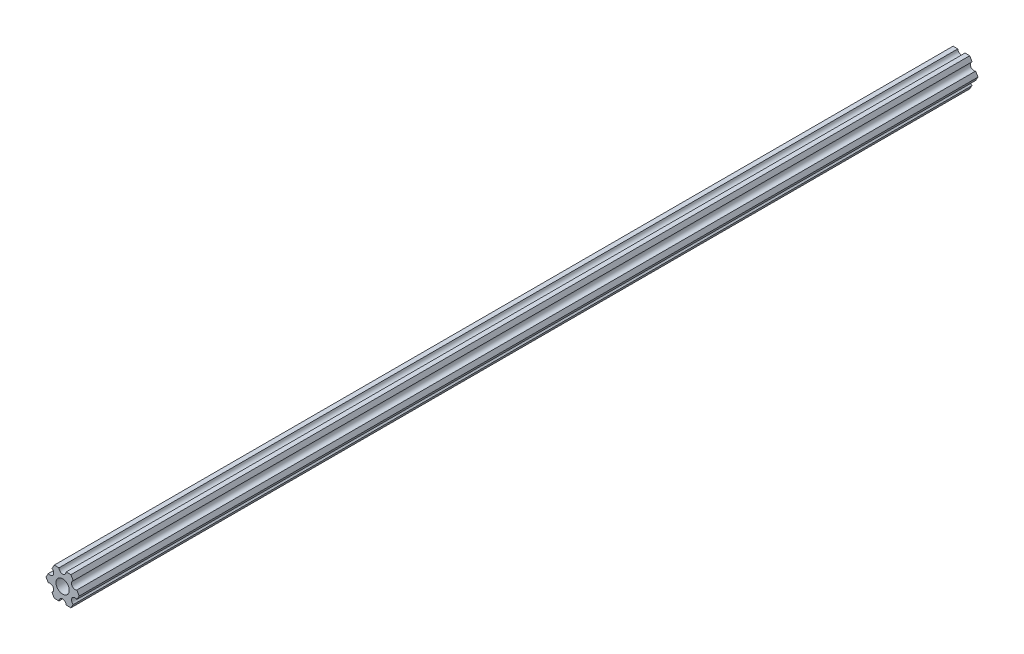
ISO-10303-21;
HEADER;
FILE_DESCRIPTION(('STEP AP214'),'2;1');
FILE_NAME('part.step','',(''),(''),'','','');
FILE_SCHEMA(('AUTOMOTIVE_DESIGN { 1 0 10303 214 1 1 1 1 }'));
ENDSEC;
DATA;
#1=APPLICATION_CONTEXT('core data for automotive mechanical design processes');
#2=APPLICATION_PROTOCOL_DEFINITION('international standard','automotive_design',2000,#1);
#3=PRODUCT_CONTEXT('',#1,'mechanical');
#4=PRODUCT('Part','Part','',(#3));
#5=PRODUCT_RELATED_PRODUCT_CATEGORY('part','',(#4));
#6=PRODUCT_DEFINITION_FORMATION('','',#4);
#7=PRODUCT_DEFINITION_CONTEXT('part definition',#1,'design');
#8=PRODUCT_DEFINITION('design','',#6,#7);
#9=PRODUCT_DEFINITION_SHAPE('','',#8);
#10=(LENGTH_UNIT() NAMED_UNIT(*) SI_UNIT(.MILLI.,.METRE.));
#11=(NAMED_UNIT(*) PLANE_ANGLE_UNIT() SI_UNIT($,.RADIAN.));
#12=(NAMED_UNIT(*) SI_UNIT($,.STERADIAN.) SOLID_ANGLE_UNIT());
#13=UNCERTAINTY_MEASURE_WITH_UNIT(LENGTH_MEASURE(1.E-05),#10,'distance_accuracy_value','');
#14=(GEOMETRIC_REPRESENTATION_CONTEXT(3) GLOBAL_UNCERTAINTY_ASSIGNED_CONTEXT((#13)) GLOBAL_UNIT_ASSIGNED_CONTEXT((#10,
#11,#12)) REPRESENTATION_CONTEXT('',''));
#15=CARTESIAN_POINT('',(0.,0.,0.));
#16=DIRECTION('',(0.,0.,1.));
#17=DIRECTION('',(1.,0.,0.));
#18=AXIS2_PLACEMENT_3D('',#15,#16,#17);
#19=CARTESIAN_POINT('',(5.49926169873049,-3.17500022210629,-92.075));
#20=DIRECTION('',(0.,0.,1.));
#21=DIRECTION('',(1.,0.,0.));
#22=AXIS2_PLACEMENT_3D('',#19,#20,#21);
#23=CYLINDRICAL_SURFACE('',#22,1.5875);
#24=CARTESIAN_POINT('',(5.49926169873049,-3.17500022210629,304.8));
#25=DIRECTION('',(0.,0.,-1.));
#26=DIRECTION('',(-1.,0.,0.));
#27=AXIS2_PLACEMENT_3D('',#24,#25,#26);
#28=CIRCLE('',#27,1.5875);
#29=CARTESIAN_POINT('',(4.7055116987305,-4.5498155506141,304.8));
#30=VERTEX_POINT('',#29);
#31=CARTESIAN_POINT('',(6.29301169873047,-1.80018489359848,304.8));
#32=VERTEX_POINT('',#31);
#33=EDGE_CURVE('E191',#30,#32,#28,.T.);
#34=ORIENTED_EDGE('',*,*,#33,.F.);
#35=DIRECTION('',(0.,0.,1.));
#36=VECTOR('',#35,1.);
#37=CARTESIAN_POINT('',(4.7055116987305,-4.5498155506141,-92.075));
#38=LINE('',#37,#36);
#39=CARTESIAN_POINT('',(4.7055116987305,-4.5498155506141,-92.075));
#40=VERTEX_POINT('',#39);
#41=EDGE_CURVE('E11',#40,#30,#38,.T.);
#42=ORIENTED_EDGE('',*,*,#41,.F.);
#43=CARTESIAN_POINT('',(5.49926169873049,-3.17500022210629,-92.075));
#44=DIRECTION('',(0.,0.,-1.));
#45=DIRECTION('',(-1.,0.,0.));
#46=AXIS2_PLACEMENT_3D('',#43,#44,#45);
#47=CIRCLE('',#46,1.5875);
#48=CARTESIAN_POINT('',(6.29301169873047,-1.80018489359848,-92.075));
#49=VERTEX_POINT('',#48);
#50=EDGE_CURVE('E242',#40,#49,#47,.T.);
#51=ORIENTED_EDGE('',*,*,#50,.T.);
#52=DIRECTION('',(0.,0.,1.));
#53=VECTOR('',#52,1.);
#54=CARTESIAN_POINT('',(6.29301169873047,-1.80018489359848,-92.075));
#55=LINE('',#54,#53);
#56=EDGE_CURVE('E37',#49,#32,#55,.T.);
#57=ORIENTED_EDGE('',*,*,#56,.T.);
#58=EDGE_LOOP('',(#34,#42,#51,#57));
#59=FACE_BOUND('',#58,.T.);
#60=ADVANCED_FACE('F34',(#59),#23,.F.);
#61=CARTESIAN_POINT('',(3.6661745940535,-6.35000022210627,-92.075));
#62=DIRECTION('',(0.866025403784446,-0.499999999999988,0.));
#63=DIRECTION('',(0.499999999999988,0.866025403784446,0.));
#64=AXIS2_PLACEMENT_3D('',#61,#62,#63);
#65=PLANE('',#64);
#66=DIRECTION('',(0.499999999999988,0.866025403784446,0.));
#67=VECTOR('',#66,1.);
#68=CARTESIAN_POINT('',(3.6661745940535,-6.35000022210627,304.8));
#69=LINE('',#68,#67);
#70=CARTESIAN_POINT('',(3.6661745940535,-6.35000022210627,304.8));
#71=VERTEX_POINT('',#70);
#72=EDGE_CURVE('E240',#71,#30,#69,.T.);
#73=ORIENTED_EDGE('',*,*,#72,.F.);
#74=DIRECTION('',(0.,0.,1.));
#75=VECTOR('',#74,1.);
#76=CARTESIAN_POINT('',(3.6661745940535,-6.35000022210627,-92.075));
#77=LINE('',#76,#75);
#78=CARTESIAN_POINT('',(3.6661745940535,-6.35000022210627,-92.075));
#79=VERTEX_POINT('',#78);
#80=EDGE_CURVE('E43',#79,#71,#77,.T.);
#81=ORIENTED_EDGE('',*,*,#80,.F.);
#82=DIRECTION('',(0.499999999999988,0.866025403784446,0.));
#83=VECTOR('',#82,1.);
#84=CARTESIAN_POINT('',(3.6661745940535,-6.35000022210627,-92.075));
#85=LINE('',#84,#83);
#86=EDGE_CURVE('E181',#79,#40,#85,.T.);
#87=ORIENTED_EDGE('',*,*,#86,.T.);
#88=ORIENTED_EDGE('',*,*,#41,.T.);
#89=EDGE_LOOP('',(#73,#81,#87,#88));
#90=FACE_BOUND('',#89,.T.);
#91=ADVANCED_FACE('F274',(#90),#65,.T.);
#92=CARTESIAN_POINT('',(1.58750038469929,-6.35000022210627,-92.075));
#93=DIRECTION('',(0.,-1.,0.));
#94=DIRECTION('',(0.,0.,-1.));
#95=AXIS2_PLACEMENT_3D('',#92,#93,#94);
#96=PLANE('',#95);
#97=DIRECTION('',(1.,0.,0.));
#98=VECTOR('',#97,1.);
#99=CARTESIAN_POINT('',(1.58750038469929,-6.35000022210627,304.8));
#100=LINE('',#99,#98);
#101=CARTESIAN_POINT('',(1.58750038469929,-6.35000022210627,304.8));
#102=VERTEX_POINT('',#101);
#103=EDGE_CURVE('E168',#102,#71,#100,.T.);
#104=ORIENTED_EDGE('',*,*,#103,.F.);
#105=DIRECTION('',(0.,0.,1.));
#106=VECTOR('',#105,1.);
#107=CARTESIAN_POINT('',(1.58750038469929,-6.35000022210627,-92.075));
#108=LINE('',#107,#106);
#109=CARTESIAN_POINT('',(1.58750038469929,-6.35000022210627,-92.075));
#110=VERTEX_POINT('',#109);
#111=EDGE_CURVE('E163',#110,#102,#108,.T.);
#112=ORIENTED_EDGE('',*,*,#111,.F.);
#113=DIRECTION('',(1.,0.,0.));
#114=VECTOR('',#113,1.);
#115=CARTESIAN_POINT('',(1.58750038469929,-6.35000022210627,-92.075));
#116=LINE('',#115,#114);
#117=EDGE_CURVE('E166',#110,#79,#116,.T.);
#118=ORIENTED_EDGE('',*,*,#117,.T.);
#119=ORIENTED_EDGE('',*,*,#80,.T.);
#120=EDGE_LOOP('',(#104,#112,#118,#119));
#121=FACE_BOUND('',#120,.T.);
#122=ADVANCED_FACE('F165',(#121),#96,.T.);
#123=CARTESIAN_POINT('',(3.84699290671026E-07,-6.35000022210627,-92.075));
#124=DIRECTION('',(0.,0.,1.));
#125=DIRECTION('',(1.,0.,0.));
#126=AXIS2_PLACEMENT_3D('',#123,#124,#125);
#127=CYLINDRICAL_SURFACE('',#126,1.5875);
#128=CARTESIAN_POINT('',(3.84699290671026E-07,-6.35000022210627,304.8));
#129=DIRECTION('',(0.,0.,-1.));
#130=DIRECTION('',(-1.,0.,0.));
#131=AXIS2_PLACEMENT_3D('',#128,#129,#130);
#132=CIRCLE('',#131,1.5875);
#133=CARTESIAN_POINT('',(-1.58749961530071,-6.35000022210627,304.8));
#134=VERTEX_POINT('',#133);
#135=EDGE_CURVE('E237',#134,#102,#132,.T.);
#136=ORIENTED_EDGE('',*,*,#135,.F.);
#137=DIRECTION('',(0.,0.,1.));
#138=VECTOR('',#137,1.);
#139=CARTESIAN_POINT('',(-1.58749961530071,-6.35000022210627,-92.075));
#140=LINE('',#139,#138);
#141=CARTESIAN_POINT('',(-1.58749961530071,-6.35000022210627,-92.075));
#142=VERTEX_POINT('',#141);
#143=EDGE_CURVE('E173',#142,#134,#140,.T.);
#144=ORIENTED_EDGE('',*,*,#143,.F.);
#145=CARTESIAN_POINT('',(3.84699290671026E-07,-6.35000022210627,-92.075));
#146=DIRECTION('',(0.,0.,-1.));
#147=DIRECTION('',(-1.,0.,0.));
#148=AXIS2_PLACEMENT_3D('',#145,#146,#147);
#149=CIRCLE('',#148,1.5875);
#150=EDGE_CURVE('E179',#142,#110,#149,.T.);
#151=ORIENTED_EDGE('',*,*,#150,.T.);
#152=ORIENTED_EDGE('',*,*,#111,.T.);
#153=EDGE_LOOP('',(#136,#144,#151,#152));
#154=FACE_BOUND('',#153,.T.);
#155=ADVANCED_FACE('F183',(#154),#127,.F.);
#156=CARTESIAN_POINT('',(-3.66617382465478,-6.35000022210627,-92.075));
#157=DIRECTION('',(0.,-1.,0.));
#158=DIRECTION('',(1.,0.,0.));
#159=AXIS2_PLACEMENT_3D('',#156,#157,#158);
#160=PLANE('',#159);
#161=DIRECTION('',(1.,0.,0.));
#162=VECTOR('',#161,1.);
#163=CARTESIAN_POINT('',(-3.66617382465478,-6.35000022210627,304.8));
#164=LINE('',#163,#162);
#165=CARTESIAN_POINT('',(-3.66617382465478,-6.35000022210627,304.8));
#166=VERTEX_POINT('',#165);
#167=EDGE_CURVE('E234',#166,#134,#164,.T.);
#168=ORIENTED_EDGE('',*,*,#167,.F.);
#169=DIRECTION('',(0.,0.,1.));
#170=VECTOR('',#169,1.);
#171=CARTESIAN_POINT('',(-3.66617382465478,-6.35000022210627,-92.075));
#172=LINE('',#171,#170);
#173=CARTESIAN_POINT('',(-3.66617382465478,-6.35000022210627,-92.075));
#174=VERTEX_POINT('',#173);
#175=EDGE_CURVE('E246',#174,#166,#172,.T.);
#176=ORIENTED_EDGE('',*,*,#175,.F.);
#177=DIRECTION('',(1.,0.,0.));
#178=VECTOR('',#177,1.);
#179=CARTESIAN_POINT('',(-3.66617382465478,-6.35000022210627,-92.075));
#180=LINE('',#179,#178);
#181=EDGE_CURVE('E184',#174,#142,#180,.T.);
#182=ORIENTED_EDGE('',*,*,#181,.T.);
#183=ORIENTED_EDGE('',*,*,#143,.T.);
#184=EDGE_LOOP('',(#168,#176,#182,#183));
#185=FACE_BOUND('',#184,.T.);
#186=ADVANCED_FACE('F287',(#185),#160,.T.);
#187=CARTESIAN_POINT('',(-4.70551103839171,-4.54981561357971,-92.075));
#188=DIRECTION('',(-0.866025373493149,-0.500000052466048,0.));
#189=DIRECTION('',(0.500000052466048,-0.86602537349315,0.));
#190=AXIS2_PLACEMENT_3D('',#187,#188,#189);
#191=PLANE('',#190);
#192=DIRECTION('',(0.500000052466048,-0.866025373493149,0.));
#193=VECTOR('',#192,1.);
#194=CARTESIAN_POINT('',(-4.70551103839171,-4.54981561357971,304.8));
#195=LINE('',#194,#193);
#196=CARTESIAN_POINT('',(-4.70551103839171,-4.54981561357971,304.8));
#197=VERTEX_POINT('',#196);
#198=EDGE_CURVE('E231',#197,#166,#195,.T.);
#199=ORIENTED_EDGE('',*,*,#198,.F.);
#200=DIRECTION('',(0.,0.,1.));
#201=VECTOR('',#200,1.);
#202=CARTESIAN_POINT('',(-4.70551103839171,-4.54981561357971,-92.075));
#203=LINE('',#202,#201);
#204=CARTESIAN_POINT('',(-4.70551103839171,-4.54981561357971,-92.075));
#205=VERTEX_POINT('',#204);
#206=EDGE_CURVE('E248',#205,#197,#203,.T.);
#207=ORIENTED_EDGE('',*,*,#206,.F.);
#208=DIRECTION('',(0.500000052466048,-0.866025373493149,0.));
#209=VECTOR('',#208,1.);
#210=CARTESIAN_POINT('',(-4.70551103839171,-4.54981561357971,-92.075));
#211=LINE('',#210,#209);
#212=EDGE_CURVE('E186',#205,#174,#211,.T.);
#213=ORIENTED_EDGE('',*,*,#212,.T.);
#214=ORIENTED_EDGE('',*,*,#175,.T.);
#215=EDGE_LOOP('',(#199,#207,#213,#214));
#216=FACE_BOUND('',#215,.T.);
#217=ADVANCED_FACE('F290',(#216),#191,.T.);
#218=CARTESIAN_POINT('',(-5.49926112168156,-3.17500033315934,-92.075));
#219=DIRECTION('',(0.,0.,1.));
#220=DIRECTION('',(1.,0.,0.));
#221=AXIS2_PLACEMENT_3D('',#218,#219,#220);
#222=CYLINDRICAL_SURFACE('',#221,1.5875);
#223=CARTESIAN_POINT('',(-5.49926112168156,-3.17500033315934,304.8));
#224=DIRECTION('',(0.,0.,-1.));
#225=DIRECTION('',(-1.,0.,0.));
#226=AXIS2_PLACEMENT_3D('',#223,#224,#225);
#227=CIRCLE('',#226,1.5875);
#228=CARTESIAN_POINT('',(-6.29301120497141,-1.80018505273897,304.8));
#229=VERTEX_POINT('',#228);
#230=EDGE_CURVE('E228',#229,#197,#227,.T.);
#231=ORIENTED_EDGE('',*,*,#230,.F.);
#232=DIRECTION('',(0.,0.,1.));
#233=VECTOR('',#232,1.);
#234=CARTESIAN_POINT('',(-6.29301120497141,-1.80018505273897,-92.075));
#235=LINE('',#234,#233);
#236=CARTESIAN_POINT('',(-6.29301120497141,-1.80018505273897,-92.075));
#237=VERTEX_POINT('',#236);
#238=EDGE_CURVE('E250',#237,#229,#235,.T.);
#239=ORIENTED_EDGE('',*,*,#238,.F.);
#240=CARTESIAN_POINT('',(-5.49926112168156,-3.17500033315934,-92.075));
#241=DIRECTION('',(0.,0.,-1.));
#242=DIRECTION('',(-1.,0.,0.));
#243=AXIS2_PLACEMENT_3D('',#240,#241,#242);
#244=CIRCLE('',#243,1.5875);
#245=EDGE_CURVE('E395',#237,#205,#244,.T.);
#246=ORIENTED_EDGE('',*,*,#245,.T.);
#247=ORIENTED_EDGE('',*,*,#206,.T.);
#248=EDGE_LOOP('',(#231,#239,#246,#247));
#249=FACE_BOUND('',#248,.T.);
#250=ADVANCED_FACE('F294',(#249),#222,.F.);
#251=CARTESIAN_POINT('',(-7.33234841870827,-4.44212523790841E-07,-92.075));
#252=DIRECTION('',(-0.866025373493149,-0.500000052466048,0.));
#253=DIRECTION('',(0.500000052466048,-0.866025373493149,0.));
#254=AXIS2_PLACEMENT_3D('',#251,#252,#253);
#255=PLANE('',#254);
#256=DIRECTION('',(0.500000052466048,-0.86602537349315,0.));
#257=VECTOR('',#256,1.);
#258=CARTESIAN_POINT('',(-7.33234841870827,-4.44212523790841E-07,304.8));
#259=LINE('',#258,#257);
#260=CARTESIAN_POINT('',(-7.33234841870827,-4.44212523790841E-07,304.8));
#261=VERTEX_POINT('',#260);
#262=EDGE_CURVE('E225',#261,#229,#259,.T.);
#263=ORIENTED_EDGE('',*,*,#262,.F.);
#264=DIRECTION('',(0.,0.,1.));
#265=VECTOR('',#264,1.);
#266=CARTESIAN_POINT('',(-7.33234841870827,-4.44212523790841E-07,-92.075));
#267=LINE('',#266,#265);
#268=CARTESIAN_POINT('',(-7.33234841870827,-4.44212523790841E-07,-92.075));
#269=VERTEX_POINT('',#268);
#270=EDGE_CURVE('E252',#269,#261,#267,.T.);
#271=ORIENTED_EDGE('',*,*,#270,.F.);
#272=DIRECTION('',(0.500000052466048,-0.86602537349315,0.));
#273=VECTOR('',#272,1.);
#274=CARTESIAN_POINT('',(-7.33234841870827,-4.44212523790841E-07,-92.075));
#275=LINE('',#274,#273);
#276=EDGE_CURVE('E392',#269,#237,#275,.T.);
#277=ORIENTED_EDGE('',*,*,#276,.T.);
#278=ORIENTED_EDGE('',*,*,#238,.T.);
#279=EDGE_LOOP('',(#263,#271,#277,#278));
#280=FACE_BOUND('',#279,.T.);
#281=ADVANCED_FACE('F298',(#280),#255,.T.);
#282=CARTESIAN_POINT('',(-6.29301142309098,1.80018429024547,-92.075));
#283=DIRECTION('',(-0.866025434075722,0.499999947533955,0.));
#284=DIRECTION('',(-0.499999947533955,-0.866025434075722,0.));
#285=AXIS2_PLACEMENT_3D('',#282,#283,#284);
#286=PLANE('',#285);
#287=DIRECTION('',(-0.499999947533955,-0.866025434075722,0.));
#288=VECTOR('',#287,1.);
#289=CARTESIAN_POINT('',(-6.29301142309098,1.80018429024547,304.8));
#290=LINE('',#289,#288);
#291=CARTESIAN_POINT('',(-6.29301142309098,1.80018429024546,304.8));
#292=VERTEX_POINT('',#291);
#293=EDGE_CURVE('E222',#292,#261,#290,.T.);
#294=ORIENTED_EDGE('',*,*,#293,.F.);
#295=DIRECTION('',(0.,0.,1.));
#296=VECTOR('',#295,1.);
#297=CARTESIAN_POINT('',(-6.29301142309098,1.80018429024546,-92.075));
#298=LINE('',#297,#296);
#299=CARTESIAN_POINT('',(-6.29301142309098,1.80018429024546,-92.075));
#300=VERTEX_POINT('',#299);
#301=EDGE_CURVE('E254',#300,#292,#298,.T.);
#302=ORIENTED_EDGE('',*,*,#301,.F.);
#303=DIRECTION('',(-0.499999947533955,-0.866025434075722,0.));
#304=VECTOR('',#303,1.);
#305=CARTESIAN_POINT('',(-6.29301142309098,1.80018429024547,-92.075));
#306=LINE('',#305,#304);
#307=EDGE_CURVE('E389',#300,#269,#306,.T.);
#308=ORIENTED_EDGE('',*,*,#307,.T.);
#309=ORIENTED_EDGE('',*,*,#270,.T.);
#310=EDGE_LOOP('',(#294,#302,#308,#309));
#311=FACE_BOUND('',#310,.T.);
#312=ADVANCED_FACE('F302',(#311),#286,.T.);
#313=CARTESIAN_POINT('',(-5.49926150638083,3.17499966684067,-92.075));
#314=DIRECTION('',(0.,0.,1.));
#315=DIRECTION('',(1.,0.,0.));
#316=AXIS2_PLACEMENT_3D('',#313,#314,#315);
#317=CYLINDRICAL_SURFACE('',#316,1.5875);
#318=CARTESIAN_POINT('',(-5.49926150638083,3.17499966684067,304.8));
#319=DIRECTION('',(0.,0.,-1.));
#320=DIRECTION('',(-1.,0.,0.));
#321=AXIS2_PLACEMENT_3D('',#318,#319,#320);
#322=CIRCLE('',#321,1.5875);
#323=CARTESIAN_POINT('',(-4.70551158967067,4.54981504343588,304.8));
#324=VERTEX_POINT('',#323);
#325=EDGE_CURVE('E219',#324,#292,#322,.T.);
#326=ORIENTED_EDGE('',*,*,#325,.F.);
#327=DIRECTION('',(0.,0.,1.));
#328=VECTOR('',#327,1.);
#329=CARTESIAN_POINT('',(-4.70551158967067,4.54981504343588,-92.075));
#330=LINE('',#329,#328);
#331=CARTESIAN_POINT('',(-4.70551158967067,4.54981504343588,-92.075));
#332=VERTEX_POINT('',#331);
#333=EDGE_CURVE('E256',#332,#324,#330,.T.);
#334=ORIENTED_EDGE('',*,*,#333,.F.);
#335=CARTESIAN_POINT('',(-5.49926150638083,3.17499966684067,-92.075));
#336=DIRECTION('',(0.,0.,-1.));
#337=DIRECTION('',(-1.,0.,0.));
#338=AXIS2_PLACEMENT_3D('',#335,#336,#337);
#339=CIRCLE('',#338,1.5875);
#340=EDGE_CURVE('E386',#332,#300,#339,.T.);
#341=ORIENTED_EDGE('',*,*,#340,.T.);
#342=ORIENTED_EDGE('',*,*,#301,.T.);
#343=EDGE_LOOP('',(#326,#334,#341,#342));
#344=FACE_BOUND('',#343,.T.);
#345=ADVANCED_FACE('F306',(#344),#317,.F.);
#346=CARTESIAN_POINT('',(-3.66617459405348,6.3499997778937,-92.075));
#347=DIRECTION('',(-0.866025434075722,0.499999947533955,0.));
#348=DIRECTION('',(-0.499999947533955,-0.866025434075722,0.));
#349=AXIS2_PLACEMENT_3D('',#346,#347,#348);
#350=PLANE('',#349);
#351=DIRECTION('',(-0.499999947533955,-0.866025434075722,0.));
#352=VECTOR('',#351,1.);
#353=CARTESIAN_POINT('',(-3.66617459405348,6.3499997778937,304.8));
#354=LINE('',#353,#352);
#355=CARTESIAN_POINT('',(-3.66617459405348,6.3499997778937,304.8));
#356=VERTEX_POINT('',#355);
#357=EDGE_CURVE('E216',#356,#324,#354,.T.);
#358=ORIENTED_EDGE('',*,*,#357,.F.);
#359=DIRECTION('',(0.,0.,1.));
#360=VECTOR('',#359,1.);
#361=CARTESIAN_POINT('',(-3.66617459405348,6.3499997778937,-92.075));
#362=LINE('',#361,#360);
#363=CARTESIAN_POINT('',(-3.66617459405348,6.3499997778937,-92.075));
#364=VERTEX_POINT('',#363);
#365=EDGE_CURVE('E258',#364,#356,#362,.T.);
#366=ORIENTED_EDGE('',*,*,#365,.F.);
#367=DIRECTION('',(-0.499999947533955,-0.866025434075722,0.));
#368=VECTOR('',#367,1.);
#369=CARTESIAN_POINT('',(-3.66617459405348,6.3499997778937,-92.075));
#370=LINE('',#369,#368);
#371=EDGE_CURVE('E383',#364,#332,#370,.T.);
#372=ORIENTED_EDGE('',*,*,#371,.T.);
#373=ORIENTED_EDGE('',*,*,#333,.T.);
#374=EDGE_LOOP('',(#358,#366,#372,#373));
#375=FACE_BOUND('',#374,.T.);
#376=ADVANCED_FACE('F310',(#375),#350,.T.);
#377=CARTESIAN_POINT('',(-1.58750038469926,6.3499997778937,-92.075));
#378=DIRECTION('',(0.,1.,0.));
#379=DIRECTION('',(0.,0.,1.));
#380=AXIS2_PLACEMENT_3D('',#377,#378,#379);
#381=PLANE('',#380);
#382=DIRECTION('',(-1.,0.,0.));
#383=VECTOR('',#382,1.);
#384=CARTESIAN_POINT('',(-1.58750038469926,6.3499997778937,304.8));
#385=LINE('',#384,#383);
#386=CARTESIAN_POINT('',(-1.58750038469926,6.3499997778937,304.8));
#387=VERTEX_POINT('',#386);
#388=EDGE_CURVE('E213',#387,#356,#385,.T.);
#389=ORIENTED_EDGE('',*,*,#388,.F.);
#390=DIRECTION('',(0.,0.,1.));
#391=VECTOR('',#390,1.);
#392=CARTESIAN_POINT('',(-1.58750038469926,6.3499997778937,-92.075));
#393=LINE('',#392,#391);
#394=CARTESIAN_POINT('',(-1.58750038469926,6.3499997778937,-92.075));
#395=VERTEX_POINT('',#394);
#396=EDGE_CURVE('E260',#395,#387,#393,.T.);
#397=ORIENTED_EDGE('',*,*,#396,.F.);
#398=DIRECTION('',(-1.,0.,0.));
#399=VECTOR('',#398,1.);
#400=CARTESIAN_POINT('',(-1.58750038469926,6.3499997778937,-92.075));
#401=LINE('',#400,#399);
#402=EDGE_CURVE('E380',#395,#364,#401,.T.);
#403=ORIENTED_EDGE('',*,*,#402,.T.);
#404=ORIENTED_EDGE('',*,*,#365,.T.);
#405=EDGE_LOOP('',(#389,#397,#403,#404));
#406=FACE_BOUND('',#405,.T.);
#407=ADVANCED_FACE('F314',(#406),#381,.T.);
#408=CARTESIAN_POINT('',(-3.84699252021695E-07,6.3499997778937,-92.075));
#409=DIRECTION('',(0.,0.,1.));
#410=DIRECTION('',(1.,0.,0.));
#411=AXIS2_PLACEMENT_3D('',#408,#409,#410);
#412=CYLINDRICAL_SURFACE('',#411,1.5875);
#413=CARTESIAN_POINT('',(-3.84699252021695E-07,6.3499997778937,304.8));
#414=DIRECTION('',(0.,0.,-1.));
#415=DIRECTION('',(-1.,0.,0.));
#416=AXIS2_PLACEMENT_3D('',#413,#414,#415);
#417=CIRCLE('',#416,1.5875);
#418=CARTESIAN_POINT('',(1.58749961530075,6.3499997778937,304.8));
#419=VERTEX_POINT('',#418);
#420=EDGE_CURVE('E210',#419,#387,#417,.T.);
#421=ORIENTED_EDGE('',*,*,#420,.F.);
#422=DIRECTION('',(0.,0.,1.));
#423=VECTOR('',#422,1.);
#424=CARTESIAN_POINT('',(1.58749961530075,6.3499997778937,-92.075));
#425=LINE('',#424,#423);
#426=CARTESIAN_POINT('',(1.58749961530075,6.3499997778937,-92.075));
#427=VERTEX_POINT('',#426);
#428=EDGE_CURVE('E262',#427,#419,#425,.T.);
#429=ORIENTED_EDGE('',*,*,#428,.F.);
#430=CARTESIAN_POINT('',(-3.84699252021695E-07,6.3499997778937,-92.075));
#431=DIRECTION('',(0.,0.,-1.));
#432=DIRECTION('',(-1.,0.,0.));
#433=AXIS2_PLACEMENT_3D('',#430,#431,#432);
#434=CIRCLE('',#433,1.5875);
#435=EDGE_CURVE('E377',#427,#395,#434,.T.);
#436=ORIENTED_EDGE('',*,*,#435,.T.);
#437=ORIENTED_EDGE('',*,*,#396,.T.);
#438=EDGE_LOOP('',(#421,#429,#436,#437));
#439=FACE_BOUND('',#438,.T.);
#440=ADVANCED_FACE('F318',(#439),#412,.F.);
#441=CARTESIAN_POINT('',(3.66617382465482,6.3499997778937,-92.075));
#442=DIRECTION('',(0.,1.,0.));
#443=DIRECTION('',(0.,0.,1.));
#444=AXIS2_PLACEMENT_3D('',#441,#442,#443);
#445=PLANE('',#444);
#446=DIRECTION('',(-1.,0.,0.));
#447=VECTOR('',#446,1.);
#448=CARTESIAN_POINT('',(3.66617382465482,6.3499997778937,304.8));
#449=LINE('',#448,#447);
#450=CARTESIAN_POINT('',(3.66617382465482,6.3499997778937,304.8));
#451=VERTEX_POINT('',#450);
#452=EDGE_CURVE('E207',#451,#419,#449,.T.);
#453=ORIENTED_EDGE('',*,*,#452,.F.);
#454=DIRECTION('',(0.,0.,1.));
#455=VECTOR('',#454,1.);
#456=CARTESIAN_POINT('',(3.66617382465482,6.3499997778937,-92.075));
#457=LINE('',#456,#455);
#458=CARTESIAN_POINT('',(3.66617382465482,6.3499997778937,-92.075));
#459=VERTEX_POINT('',#458);
#460=EDGE_CURVE('E264',#459,#451,#457,.T.);
#461=ORIENTED_EDGE('',*,*,#460,.F.);
#462=DIRECTION('',(-1.,0.,0.));
#463=VECTOR('',#462,1.);
#464=CARTESIAN_POINT('',(3.66617382465482,6.3499997778937,-92.075));
#465=LINE('',#464,#463);
#466=EDGE_CURVE('E374',#459,#427,#465,.T.);
#467=ORIENTED_EDGE('',*,*,#466,.T.);
#468=ORIENTED_EDGE('',*,*,#428,.T.);
#469=EDGE_LOOP('',(#453,#461,#467,#468));
#470=FACE_BOUND('',#469,.T.);
#471=ADVANCED_FACE('F322',(#470),#445,.T.);
#472=CARTESIAN_POINT('',(4.70551118909645,4.54981503427037,-92.075));
#473=DIRECTION('',(0.866025358347508,0.500000078699064,0.));
#474=DIRECTION('',(-0.500000078699064,0.866025358347508,0.));
#475=AXIS2_PLACEMENT_3D('',#472,#473,#474);
#476=PLANE('',#475);
#477=DIRECTION('',(-0.500000078699064,0.866025358347508,0.));
#478=VECTOR('',#477,1.);
#479=CARTESIAN_POINT('',(4.70551118909645,4.54981503427037,304.8));
#480=LINE('',#479,#478);
#481=CARTESIAN_POINT('',(4.70551118909645,4.54981503427037,304.8));
#482=VERTEX_POINT('',#481);
#483=EDGE_CURVE('E204',#482,#451,#480,.T.);
#484=ORIENTED_EDGE('',*,*,#483,.F.);
#485=DIRECTION('',(0.,0.,1.));
#486=VECTOR('',#485,1.);
#487=CARTESIAN_POINT('',(4.70551118909645,4.54981503427037,-92.075));
#488=LINE('',#487,#486);
#489=CARTESIAN_POINT('',(4.70551118909645,4.54981503427037,-92.075));
#490=VERTEX_POINT('',#489);
#491=EDGE_CURVE('E266',#490,#482,#488,.T.);
#492=ORIENTED_EDGE('',*,*,#491,.F.);
#493=DIRECTION('',(-0.500000078699064,0.866025358347508,0.));
#494=VECTOR('',#493,1.);
#495=CARTESIAN_POINT('',(4.70551118909645,4.54981503427037,-92.075));
#496=LINE('',#495,#494);
#497=EDGE_CURVE('E371',#490,#459,#496,.T.);
#498=ORIENTED_EDGE('',*,*,#497,.T.);
#499=ORIENTED_EDGE('',*,*,#460,.T.);
#500=EDGE_LOOP('',(#484,#492,#498,#499));
#501=FACE_BOUND('',#500,.T.);
#502=ADVANCED_FACE('F326',(#501),#476,.T.);
#503=CARTESIAN_POINT('',(5.49926131403121,3.1749997778937,-92.075));
#504=DIRECTION('',(0.,0.,1.));
#505=DIRECTION('',(1.,0.,0.));
#506=AXIS2_PLACEMENT_3D('',#503,#504,#505);
#507=CYLINDRICAL_SURFACE('',#506,1.5875);
#508=CARTESIAN_POINT('',(5.49926131403121,3.1749997778937,304.8));
#509=DIRECTION('',(0.,0.,-1.));
#510=DIRECTION('',(-1.,0.,0.));
#511=AXIS2_PLACEMENT_3D('',#508,#509,#510);
#512=CIRCLE('',#511,1.5875);
#513=CARTESIAN_POINT('',(6.29301143896598,1.80018452151703,304.8));
#514=VERTEX_POINT('',#513);
#515=EDGE_CURVE('E201',#514,#482,#512,.T.);
#516=ORIENTED_EDGE('',*,*,#515,.F.);
#517=DIRECTION('',(0.,0.,1.));
#518=VECTOR('',#517,1.);
#519=CARTESIAN_POINT('',(6.29301143896598,1.80018452151703,-92.075));
#520=LINE('',#519,#518);
#521=CARTESIAN_POINT('',(6.29301143896598,1.80018452151703,-92.075));
#522=VERTEX_POINT('',#521);
#523=EDGE_CURVE('E268',#522,#514,#520,.T.);
#524=ORIENTED_EDGE('',*,*,#523,.F.);
#525=CARTESIAN_POINT('',(5.49926131403121,3.1749997778937,-92.075));
#526=DIRECTION('',(0.,0.,-1.));
#527=DIRECTION('',(-1.,0.,0.));
#528=AXIS2_PLACEMENT_3D('',#525,#526,#527);
#529=CIRCLE('',#528,1.5875);
#530=EDGE_CURVE('E368',#522,#490,#529,.T.);
#531=ORIENTED_EDGE('',*,*,#530,.T.);
#532=ORIENTED_EDGE('',*,*,#491,.T.);
#533=EDGE_LOOP('',(#516,#524,#531,#532));
#534=FACE_BOUND('',#533,.T.);
#535=ADVANCED_FACE('F330',(#534),#507,.F.);
#536=CARTESIAN_POINT('',(7.33234880340755,-2.22106190273918E-07,-92.075));
#537=DIRECTION('',(0.866025358347509,0.500000078699063,0.));
#538=DIRECTION('',(-0.500000078699063,0.866025358347509,0.));
#539=AXIS2_PLACEMENT_3D('',#536,#537,#538);
#540=PLANE('',#539);
#541=DIRECTION('',(-0.500000078699063,0.866025358347509,0.));
#542=VECTOR('',#541,1.);
#543=CARTESIAN_POINT('',(7.33234880340755,-2.22106190273918E-07,304.8));
#544=LINE('',#543,#542);
#545=CARTESIAN_POINT('',(7.33234880340755,-2.22106190273918E-07,304.8));
#546=VERTEX_POINT('',#545);
#547=EDGE_CURVE('E198',#546,#514,#544,.T.);
#548=ORIENTED_EDGE('',*,*,#547,.F.);
#549=DIRECTION('',(0.,0.,1.));
#550=VECTOR('',#549,1.);
#551=CARTESIAN_POINT('',(7.33234880340755,-2.22106190273918E-07,-92.075));
#552=LINE('',#551,#550);
#553=CARTESIAN_POINT('',(7.33234880340755,-2.22106190273918E-07,-92.075));
#554=VERTEX_POINT('',#553);
#555=EDGE_CURVE('E269',#554,#546,#552,.T.);
#556=ORIENTED_EDGE('',*,*,#555,.F.);
#557=DIRECTION('',(-0.500000078699063,0.866025358347509,0.));
#558=VECTOR('',#557,1.);
#559=CARTESIAN_POINT('',(7.33234880340755,-2.22106190273918E-07,-92.075));
#560=LINE('',#559,#558);
#561=EDGE_CURVE('E365',#554,#522,#560,.T.);
#562=ORIENTED_EDGE('',*,*,#561,.T.);
#563=ORIENTED_EDGE('',*,*,#523,.T.);
#564=EDGE_LOOP('',(#548,#556,#562,#563));
#565=FACE_BOUND('',#564,.T.);
#566=ADVANCED_FACE('F334',(#565),#540,.T.);
#567=CARTESIAN_POINT('',(6.29301169873047,-1.80018489359848,-92.075));
#568=DIRECTION('',(0.866025403784445,-0.499999999999988,0.));
#569=DIRECTION('',(0.499999999999988,0.866025403784446,0.));
#570=AXIS2_PLACEMENT_3D('',#567,#568,#569);
#571=PLANE('',#570);
#572=DIRECTION('',(0.499999999999988,0.866025403784446,0.));
#573=VECTOR('',#572,1.);
#574=CARTESIAN_POINT('',(6.29301169873047,-1.80018489359848,304.8));
#575=LINE('',#574,#573);
#576=EDGE_CURVE('E194',#32,#546,#575,.T.);
#577=ORIENTED_EDGE('',*,*,#576,.F.);
#578=ORIENTED_EDGE('',*,*,#56,.F.);
#579=DIRECTION('',(0.499999999999988,0.866025403784446,0.));
#580=VECTOR('',#579,1.);
#581=CARTESIAN_POINT('',(6.29301169873047,-1.80018489359848,-92.075));
#582=LINE('',#581,#580);
#583=EDGE_CURVE('E363',#49,#554,#582,.T.);
#584=ORIENTED_EDGE('',*,*,#583,.T.);
#585=ORIENTED_EDGE('',*,*,#555,.T.);
#586=EDGE_LOOP('',(#577,#578,#584,#585));
#587=FACE_BOUND('',#586,.T.);
#588=ADVANCED_FACE('F271',(#587),#571,.T.);
#589=CARTESIAN_POINT('',(5.49926169873049,-3.17500022210629,-92.075));
#590=DIRECTION('',(0.,0.,-1.));
#591=DIRECTION('',(-1.,0.,0.));
#592=AXIS2_PLACEMENT_3D('',#589,#590,#591);
#593=PLANE('',#592);
#594=CARTESIAN_POINT('',(0.,0.,-92.075));
#595=DIRECTION('',(0.,0.,1.));
#596=DIRECTION('',(-1.,0.,0.));
#597=AXIS2_PLACEMENT_3D('',#594,#595,#596);
#598=CIRCLE('',#597,2.9337);
#599=CARTESIAN_POINT('',(2.9337,0.,-92.075));
#600=VERTEX_POINT('',#599);
#601=EDGE_CURVE('E195',#600,#600,#598,.T.);
#602=ORIENTED_EDGE('',*,*,#601,.T.);
#603=EDGE_LOOP('',(#602));
#604=FACE_BOUND('',#603,.T.);
#605=ORIENTED_EDGE('',*,*,#50,.F.);
#606=ORIENTED_EDGE('',*,*,#86,.F.);
#607=ORIENTED_EDGE('',*,*,#117,.F.);
#608=ORIENTED_EDGE('',*,*,#150,.F.);
#609=ORIENTED_EDGE('',*,*,#181,.F.);
#610=ORIENTED_EDGE('',*,*,#212,.F.);
#611=ORIENTED_EDGE('',*,*,#245,.F.);
#612=ORIENTED_EDGE('',*,*,#276,.F.);
#613=ORIENTED_EDGE('',*,*,#307,.F.);
#614=ORIENTED_EDGE('',*,*,#340,.F.);
#615=ORIENTED_EDGE('',*,*,#371,.F.);
#616=ORIENTED_EDGE('',*,*,#402,.F.);
#617=ORIENTED_EDGE('',*,*,#435,.F.);
#618=ORIENTED_EDGE('',*,*,#466,.F.);
#619=ORIENTED_EDGE('',*,*,#497,.F.);
#620=ORIENTED_EDGE('',*,*,#530,.F.);
#621=ORIENTED_EDGE('',*,*,#561,.F.);
#622=ORIENTED_EDGE('',*,*,#583,.F.);
#623=EDGE_LOOP('',(#605,#606,#607,#608,#609,#610,#611,#612,#613,#614,#615,#616,#617,#618,#619,
#620,#621,#622));
#624=FACE_BOUND('',#623,.T.);
#625=ADVANCED_FACE('F177',(#604,#624),#593,.T.);
#626=CARTESIAN_POINT('',(5.49926169873049,-3.17500022210629,304.8));
#627=DIRECTION('',(0.,0.,-1.));
#628=DIRECTION('',(-1.,0.,0.));
#629=AXIS2_PLACEMENT_3D('',#626,#627,#628);
#630=PLANE('',#629);
#631=CARTESIAN_POINT('',(0.,0.,304.8));
#632=DIRECTION('',(0.,0.,1.));
#633=DIRECTION('',(-1.,0.,0.));
#634=AXIS2_PLACEMENT_3D('',#631,#632,#633);
#635=CIRCLE('',#634,2.9337);
#636=CARTESIAN_POINT('',(2.9337,0.,304.8));
#637=VERTEX_POINT('',#636);
#638=EDGE_CURVE('E358',#637,#637,#635,.T.);
#639=ORIENTED_EDGE('',*,*,#638,.F.);
#640=EDGE_LOOP('',(#639));
#641=FACE_BOUND('',#640,.T.);
#642=ORIENTED_EDGE('',*,*,#33,.T.);
#643=ORIENTED_EDGE('',*,*,#576,.T.);
#644=ORIENTED_EDGE('',*,*,#547,.T.);
#645=ORIENTED_EDGE('',*,*,#515,.T.);
#646=ORIENTED_EDGE('',*,*,#483,.T.);
#647=ORIENTED_EDGE('',*,*,#452,.T.);
#648=ORIENTED_EDGE('',*,*,#420,.T.);
#649=ORIENTED_EDGE('',*,*,#388,.T.);
#650=ORIENTED_EDGE('',*,*,#357,.T.);
#651=ORIENTED_EDGE('',*,*,#325,.T.);
#652=ORIENTED_EDGE('',*,*,#293,.T.);
#653=ORIENTED_EDGE('',*,*,#262,.T.);
#654=ORIENTED_EDGE('',*,*,#230,.T.);
#655=ORIENTED_EDGE('',*,*,#198,.T.);
#656=ORIENTED_EDGE('',*,*,#167,.T.);
#657=ORIENTED_EDGE('',*,*,#135,.T.);
#658=ORIENTED_EDGE('',*,*,#103,.T.);
#659=ORIENTED_EDGE('',*,*,#72,.T.);
#660=EDGE_LOOP('',(#642,#643,#644,#645,#646,#647,#648,#649,#650,#651,#652,#653,#654,#655,#656,
#657,#658,#659));
#661=FACE_BOUND('',#660,.T.);
#662=ADVANCED_FACE('F273',(#641,#661),#630,.F.);
#663=CARTESIAN_POINT('',(0.,0.,-92.075));
#664=DIRECTION('',(0.,0.,1.));
#665=DIRECTION('',(1.,0.,0.));
#666=AXIS2_PLACEMENT_3D('',#663,#664,#665);
#667=CYLINDRICAL_SURFACE('',#666,2.9337);
#668=CARTESIAN_POINT('',(2.9337,0.,-92.075));
#669=CARTESIAN_POINT('',(2.9337,0.,-87.9408854166666));
#670=CARTESIAN_POINT('',(2.9337,0.,-83.8067708333333));
#671=CARTESIAN_POINT('',(2.9337,0.,-75.5385416666666));
#672=CARTESIAN_POINT('',(2.9337,0.,-71.4044270833333));
#673=CARTESIAN_POINT('',(2.9337,0.,-63.1361979166666));
#674=CARTESIAN_POINT('',(2.9337,0.,-59.0020833333333));
#675=CARTESIAN_POINT('',(2.9337,0.,-50.7338541666666));
#676=CARTESIAN_POINT('',(2.9337,0.,-46.5997395833333));
#677=CARTESIAN_POINT('',(2.9337,0.,-38.3315104166666));
#678=CARTESIAN_POINT('',(2.9337,0.,-34.1973958333333));
#679=CARTESIAN_POINT('',(2.9337,0.,-25.9291666666666));
#680=CARTESIAN_POINT('',(2.9337,0.,-21.7950520833333));
#681=CARTESIAN_POINT('',(2.9337,0.,-13.5268229166667));
#682=CARTESIAN_POINT('',(2.9337,0.,-9.39270833333332));
#683=CARTESIAN_POINT('',(2.9337,0.,-1.12447916666665));
#684=CARTESIAN_POINT('',(2.9337,0.,3.00963541666668));
#685=CARTESIAN_POINT('',(2.9337,0.,11.2778645833334));
#686=CARTESIAN_POINT('',(2.9337,0.,15.4119791666667));
#687=CARTESIAN_POINT('',(2.9337,0.,23.6802083333334));
#688=CARTESIAN_POINT('',(2.9337,0.,27.8143229166667));
#689=CARTESIAN_POINT('',(2.9337,0.,36.0825520833334));
#690=CARTESIAN_POINT('',(2.9337,0.,40.2166666666667));
#691=CARTESIAN_POINT('',(2.9337,0.,48.4848958333333));
#692=CARTESIAN_POINT('',(2.9337,0.,52.6190104166667));
#693=CARTESIAN_POINT('',(2.9337,0.,60.8872395833333));
#694=CARTESIAN_POINT('',(2.9337,0.,65.0213541666667));
#695=CARTESIAN_POINT('',(2.9337,0.,73.2895833333333));
#696=CARTESIAN_POINT('',(2.9337,0.,77.4236979166667));
#697=CARTESIAN_POINT('',(2.9337,0.,85.6919270833333));
#698=CARTESIAN_POINT('',(2.9337,0.,89.8260416666667));
#699=CARTESIAN_POINT('',(2.9337,0.,98.0942708333333));
#700=CARTESIAN_POINT('',(2.9337,0.,102.228385416667));
#701=CARTESIAN_POINT('',(2.9337,0.,110.496614583333));
#702=CARTESIAN_POINT('',(2.9337,0.,114.630729166667));
#703=CARTESIAN_POINT('',(2.9337,0.,122.898958333333));
#704=CARTESIAN_POINT('',(2.9337,0.,127.033072916667));
#705=CARTESIAN_POINT('',(2.9337,0.,135.301302083333));
#706=CARTESIAN_POINT('',(2.9337,0.,139.435416666667));
#707=CARTESIAN_POINT('',(2.9337,0.,147.703645833333));
#708=CARTESIAN_POINT('',(2.9337,0.,151.837760416667));
#709=CARTESIAN_POINT('',(2.9337,0.,160.105989583333));
#710=CARTESIAN_POINT('',(2.9337,0.,164.240104166667));
#711=CARTESIAN_POINT('',(2.9337,0.,172.508333333333));
#712=CARTESIAN_POINT('',(2.9337,0.,176.642447916667));
#713=CARTESIAN_POINT('',(2.9337,0.,184.910677083333));
#714=CARTESIAN_POINT('',(2.9337,0.,189.044791666667));
#715=CARTESIAN_POINT('',(2.9337,0.,197.313020833333));
#716=CARTESIAN_POINT('',(2.9337,0.,201.447135416667));
#717=CARTESIAN_POINT('',(2.9337,0.,209.715364583333));
#718=CARTESIAN_POINT('',(2.9337,0.,213.849479166667));
#719=CARTESIAN_POINT('',(2.9337,0.,222.117708333333));
#720=CARTESIAN_POINT('',(2.9337,0.,226.251822916667));
#721=CARTESIAN_POINT('',(2.9337,0.,234.520052083333));
#722=CARTESIAN_POINT('',(2.9337,0.,238.654166666667));
#723=CARTESIAN_POINT('',(2.9337,0.,246.922395833333));
#724=CARTESIAN_POINT('',(2.9337,0.,251.056510416667));
#725=CARTESIAN_POINT('',(2.9337,0.,259.324739583333));
#726=CARTESIAN_POINT('',(2.9337,0.,263.458854166667));
#727=CARTESIAN_POINT('',(2.9337,0.,271.727083333333));
#728=CARTESIAN_POINT('',(2.9337,0.,275.861197916667));
#729=CARTESIAN_POINT('',(2.9337,0.,284.129427083333));
#730=CARTESIAN_POINT('',(2.9337,0.,288.263541666667));
#731=CARTESIAN_POINT('',(2.9337,0.,296.531770833333));
#732=CARTESIAN_POINT('',(2.9337,0.,300.665885416667));
#733=CARTESIAN_POINT('',(2.9337,0.,304.8));
#734=B_SPLINE_CURVE_WITH_KNOTS('',3,(#668,#669,#670,#671,#672,#673,#674,#675,#676,#677,#678,
#679,#680,#681,#682,#683,#684,#685,#686,#687,#688,#689,#690,#691,#692,#693,#694,#695,#696,#697,
#698,#699,#700,#701,#702,#703,#704,#705,#706,#707,#708,#709,#710,#711,#712,#713,#714,#715,#716,
#717,#718,#719,#720,#721,#722,#723,#724,#725,#726,#727,#728,#729,#730,#731,#732,#733),
.UNSPECIFIED.,.F.,.F.,(4,2,2,2,2,2,2,2,2,2,2,2,2,2,2,2,2,2,2,2,2,2,2,2,2,2,2,2,2,2,2,2,4),(0.,
12.40234375,24.8046875,37.20703125,49.609375,62.01171875,74.4140625,86.81640625,99.21875,
111.62109375,124.0234375,136.42578125,148.828125,161.23046875,173.6328125,186.03515625,198.4375,
210.83984375,223.2421875,235.64453125,248.046875,260.44921875,272.8515625,285.25390625,
297.65625,310.05859375,322.4609375,334.86328125,347.265625,359.66796875,372.0703125,
384.47265625,396.875),.UNSPECIFIED.);
#735=EDGE_CURVE('BSEAM346',#600,#637,#734,.T.);
#736=ORIENTED_EDGE('',*,*,#601,.F.);
#737=ORIENTED_EDGE('',*,*,#638,.T.);
#738=ORIENTED_EDGE('',*,*,#735,.T.);
#739=ORIENTED_EDGE('',*,*,#735,.F.);
#740=EDGE_LOOP('',(#736,#738,#737,#739));
#741=FACE_BOUND('',#740,.T.);
#742=ADVANCED_FACE('F346',(#741),#667,.F.);
#743=CLOSED_SHELL('',(#60,#91,#122,#155,#186,#217,#250,#281,#312,#345,#376,#407,#440,#471,#502,
#535,#566,#588,#625,#662,#742));
#744=MANIFOLD_SOLID_BREP('B2',#743);
#745=ADVANCED_BREP_SHAPE_REPRESENTATION('',(#18,#744),#14);
#746=SHAPE_DEFINITION_REPRESENTATION(#9,#745);
ENDSEC;
END-ISO-10303-21;
